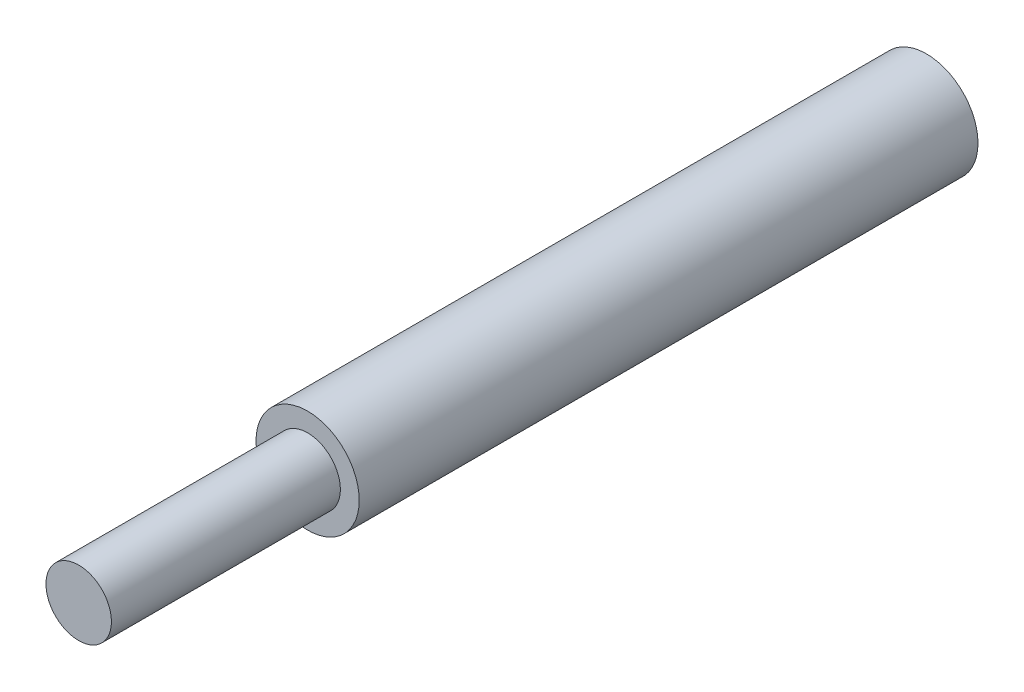
ISO-10303-21;
HEADER;
FILE_DESCRIPTION(('STEP AP214'),'2;1');
FILE_NAME('part.step','',(''),(''),'','','');
FILE_SCHEMA(('AUTOMOTIVE_DESIGN { 1 0 10303 214 1 1 1 1 }'));
ENDSEC;
DATA;
#1=APPLICATION_CONTEXT('core data for automotive mechanical design processes');
#2=APPLICATION_PROTOCOL_DEFINITION('international standard','automotive_design',2000,#1);
#3=PRODUCT_CONTEXT('',#1,'mechanical');
#4=PRODUCT('Part','Part','',(#3));
#5=PRODUCT_RELATED_PRODUCT_CATEGORY('part','',(#4));
#6=PRODUCT_DEFINITION_FORMATION('','',#4);
#7=PRODUCT_DEFINITION_CONTEXT('part definition',#1,'design');
#8=PRODUCT_DEFINITION('design','',#6,#7);
#9=PRODUCT_DEFINITION_SHAPE('','',#8);
#10=(LENGTH_UNIT() NAMED_UNIT(*) SI_UNIT(.MILLI.,.METRE.));
#11=(NAMED_UNIT(*) PLANE_ANGLE_UNIT() SI_UNIT($,.RADIAN.));
#12=(NAMED_UNIT(*) SI_UNIT($,.STERADIAN.) SOLID_ANGLE_UNIT());
#13=UNCERTAINTY_MEASURE_WITH_UNIT(LENGTH_MEASURE(1.E-05),#10,'distance_accuracy_value','');
#14=(GEOMETRIC_REPRESENTATION_CONTEXT(3) GLOBAL_UNCERTAINTY_ASSIGNED_CONTEXT((#13)) GLOBAL_UNIT_ASSIGNED_CONTEXT((#10,
#11,#12)) REPRESENTATION_CONTEXT('',''));
#15=CARTESIAN_POINT('',(0.,0.,0.));
#16=DIRECTION('',(0.,0.,1.));
#17=DIRECTION('',(1.,0.,0.));
#18=AXIS2_PLACEMENT_3D('',#15,#16,#17);
#19=CARTESIAN_POINT('',(0.,0.,104.5));
#20=DIRECTION('',(0.,0.,-1.));
#21=DIRECTION('',(-1.,0.,0.));
#22=AXIS2_PLACEMENT_3D('',#19,#20,#21);
#23=CYLINDRICAL_SURFACE('',#22,5.);
#24=CARTESIAN_POINT('',(0.,0.,104.5));
#25=DIRECTION('',(0.,0.,1.));
#26=DIRECTION('',(1.,0.,0.));
#27=AXIS2_PLACEMENT_3D('',#24,#25,#26);
#28=CIRCLE('',#27,5.);
#29=CARTESIAN_POINT('',(5.,0.,104.5));
#30=VERTEX_POINT('',#29);
#31=EDGE_CURVE('E42',#30,#30,#28,.T.);
#32=ORIENTED_EDGE('',*,*,#31,.F.);
#33=EDGE_LOOP('',(#32));
#34=FACE_BOUND('',#33,.T.);
#35=CARTESIAN_POINT('',(0.,0.,44.5));
#36=DIRECTION('',(0.,0.,1.));
#37=DIRECTION('',(1.,0.,0.));
#38=AXIS2_PLACEMENT_3D('',#35,#36,#37);
#39=CIRCLE('',#38,5.);
#40=CARTESIAN_POINT('',(5.,0.,44.5));
#41=VERTEX_POINT('',#40);
#42=EDGE_CURVE('E37',#41,#41,#39,.T.);
#43=ORIENTED_EDGE('',*,*,#42,.T.);
#44=EDGE_LOOP('',(#43));
#45=FACE_BOUND('',#44,.T.);
#46=ADVANCED_FACE('F40',(#34,#45),#23,.T.);
#47=CARTESIAN_POINT('',(0.,0.,104.5));
#48=DIRECTION('',(0.,0.,1.));
#49=DIRECTION('',(1.,0.,0.));
#50=AXIS2_PLACEMENT_3D('',#47,#48,#49);
#51=PLANE('',#50);
#52=CARTESIAN_POINT('',(0.,0.,104.5));
#53=DIRECTION('',(0.,0.,1.));
#54=DIRECTION('',(1.,0.,0.));
#55=AXIS2_PLACEMENT_3D('',#52,#53,#54);
#56=CIRCLE('',#55,3.175);
#57=CARTESIAN_POINT('',(3.175,0.,104.5));
#58=VERTEX_POINT('',#57);
#59=EDGE_CURVE('E10',#58,#58,#56,.T.);
#60=ORIENTED_EDGE('',*,*,#59,.F.);
#61=EDGE_LOOP('',(#60));
#62=FACE_BOUND('',#61,.T.);
#63=ORIENTED_EDGE('',*,*,#31,.T.);
#64=EDGE_LOOP('',(#63));
#65=FACE_BOUND('',#64,.T.);
#66=ADVANCED_FACE('F63',(#62,#65),#51,.T.);
#67=CARTESIAN_POINT('',(0.,0.,44.5));
#68=DIRECTION('',(0.,0.,1.));
#69=DIRECTION('',(1.,0.,0.));
#70=AXIS2_PLACEMENT_3D('',#67,#68,#69);
#71=PLANE('',#70);
#72=ORIENTED_EDGE('',*,*,#42,.F.);
#73=EDGE_LOOP('',(#72));
#74=FACE_BOUND('',#73,.T.);
#75=ADVANCED_FACE('F59',(#74),#71,.F.);
#76=CARTESIAN_POINT('',(0.,0.,126.7));
#77=DIRECTION('',(0.,0.,-1.));
#78=DIRECTION('',(-1.,0.,0.));
#79=AXIS2_PLACEMENT_3D('',#76,#77,#78);
#80=CYLINDRICAL_SURFACE('',#79,3.175);
#81=CARTESIAN_POINT('',(0.,0.,126.7));
#82=DIRECTION('',(0.,0.,1.));
#83=DIRECTION('',(1.,0.,0.));
#84=AXIS2_PLACEMENT_3D('',#81,#82,#83);
#85=CIRCLE('',#84,3.175);
#86=CARTESIAN_POINT('',(3.175,0.,126.7));
#87=VERTEX_POINT('',#86);
#88=EDGE_CURVE('E49',#87,#87,#85,.T.);
#89=ORIENTED_EDGE('',*,*,#88,.F.);
#90=EDGE_LOOP('',(#89));
#91=FACE_BOUND('',#90,.T.);
#92=ORIENTED_EDGE('',*,*,#59,.T.);
#93=EDGE_LOOP('',(#92));
#94=FACE_BOUND('',#93,.T.);
#95=ADVANCED_FACE('F58',(#91,#94),#80,.T.);
#96=CARTESIAN_POINT('',(0.,0.,126.7));
#97=DIRECTION('',(0.,0.,1.));
#98=DIRECTION('',(1.,0.,0.));
#99=AXIS2_PLACEMENT_3D('',#96,#97,#98);
#100=PLANE('',#99);
#101=ORIENTED_EDGE('',*,*,#88,.T.);
#102=EDGE_LOOP('',(#101));
#103=FACE_BOUND('',#102,.T.);
#104=ADVANCED_FACE('F70',(#103),#100,.T.);
#105=CLOSED_SHELL('',(#46,#66,#75,#95,#104));
#106=MANIFOLD_SOLID_BREP('B2',#105);
#107=ADVANCED_BREP_SHAPE_REPRESENTATION('',(#18,#106),#14);
#108=SHAPE_DEFINITION_REPRESENTATION(#9,#107);
ENDSEC;
END-ISO-10303-21;
